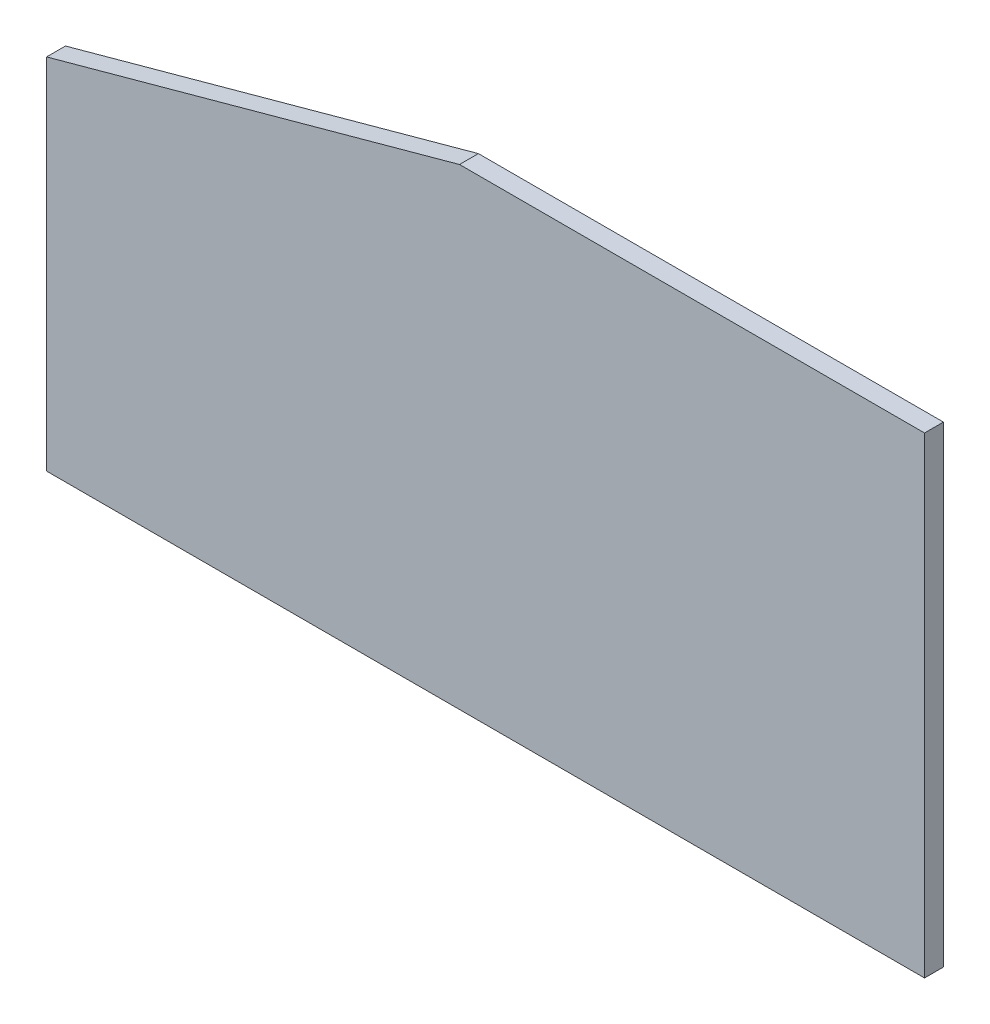
ISO-10303-21;
HEADER;
FILE_DESCRIPTION(('STEP AP214'),'2;1');
FILE_NAME('part.step','',(''),(''),'','','');
FILE_SCHEMA(('AUTOMOTIVE_DESIGN { 1 0 10303 214 1 1 1 1 }'));
ENDSEC;
DATA;
#1=APPLICATION_CONTEXT('core data for automotive mechanical design processes');
#2=APPLICATION_PROTOCOL_DEFINITION('international standard','automotive_design',2000,#1);
#3=PRODUCT_CONTEXT('',#1,'mechanical');
#4=PRODUCT('Part','Part','',(#3));
#5=PRODUCT_RELATED_PRODUCT_CATEGORY('part','',(#4));
#6=PRODUCT_DEFINITION_FORMATION('','',#4);
#7=PRODUCT_DEFINITION_CONTEXT('part definition',#1,'design');
#8=PRODUCT_DEFINITION('design','',#6,#7);
#9=PRODUCT_DEFINITION_SHAPE('','',#8);
#10=(LENGTH_UNIT() NAMED_UNIT(*) SI_UNIT(.MILLI.,.METRE.));
#11=(NAMED_UNIT(*) PLANE_ANGLE_UNIT() SI_UNIT($,.RADIAN.));
#12=(NAMED_UNIT(*) SI_UNIT($,.STERADIAN.) SOLID_ANGLE_UNIT());
#13=UNCERTAINTY_MEASURE_WITH_UNIT(LENGTH_MEASURE(1.E-05),#10,'distance_accuracy_value','');
#14=(GEOMETRIC_REPRESENTATION_CONTEXT(3) GLOBAL_UNCERTAINTY_ASSIGNED_CONTEXT((#13)) GLOBAL_UNIT_ASSIGNED_CONTEXT((#10,
#11,#12)) REPRESENTATION_CONTEXT('',''));
#15=CARTESIAN_POINT('',(0.,0.,0.));
#16=DIRECTION('',(0.,0.,1.));
#17=DIRECTION('',(1.,0.,0.));
#18=AXIS2_PLACEMENT_3D('',#15,#16,#17);
#19=CARTESIAN_POINT('',(-389.52380952381,-57.2916666666644,4.99999999999889));
#20=DIRECTION('',(1.,0.,0.));
#21=DIRECTION('',(0.,0.,-1.));
#22=AXIS2_PLACEMENT_3D('',#19,#20,#21);
#23=PLANE('',#22);
#24=DIRECTION('',(0.,-1.,0.));
#25=VECTOR('',#24,1.);
#26=CARTESIAN_POINT('',(-389.52380952381,-57.2916666666644,-1.38777878078145E-12));
#27=LINE('',#26,#25);
#28=CARTESIAN_POINT('',(-389.52380952381,37.7083333333333,-1.83186799063151E-12));
#29=VERTEX_POINT('',#28);
#30=CARTESIAN_POINT('',(-389.52380952381,-57.2916666666644,-1.38777878078145E-12));
#31=VERTEX_POINT('',#30);
#32=EDGE_CURVE('E109',#29,#31,#27,.T.);
#33=ORIENTED_EDGE('',*,*,#32,.T.);
#34=DIRECTION('',(0.,0.,-1.));
#35=VECTOR('',#34,1.);
#36=CARTESIAN_POINT('',(-389.52380952381,-57.2916666666644,4.99999999999889));
#37=LINE('',#36,#35);
#38=CARTESIAN_POINT('',(-389.52380952381,-57.2916666666644,4.99999999999889));
#39=VERTEX_POINT('',#38);
#40=EDGE_CURVE('E11',#39,#31,#37,.T.);
#41=ORIENTED_EDGE('',*,*,#40,.F.);
#42=DIRECTION('',(0.,-1.,0.));
#43=VECTOR('',#42,1.);
#44=CARTESIAN_POINT('',(-389.52380952381,-57.2916666666644,4.99999999999889));
#45=LINE('',#44,#43);
#46=CARTESIAN_POINT('',(-389.52380952381,37.7083333333378,4.99999999999823));
#47=VERTEX_POINT('',#46);
#48=EDGE_CURVE('E117',#47,#39,#45,.T.);
#49=ORIENTED_EDGE('',*,*,#48,.F.);
#50=DIRECTION('',(0.,0.,-1.));
#51=VECTOR('',#50,1.);
#52=CARTESIAN_POINT('',(-389.52380952381,37.7083333333378,4.99999999999823));
#53=LINE('',#52,#51);
#54=EDGE_CURVE('E105',#47,#29,#53,.T.);
#55=ORIENTED_EDGE('',*,*,#54,.T.);
#56=EDGE_LOOP('',(#33,#41,#49,#55));
#57=FACE_BOUND('',#56,.T.);
#58=ADVANCED_FACE('F35',(#57),#23,.F.);
#59=CARTESIAN_POINT('',(-389.52380952381,-57.2916666666644,4.99999999999889));
#60=DIRECTION('',(0.,1.,0.));
#61=DIRECTION('',(0.,0.,1.));
#62=AXIS2_PLACEMENT_3D('',#59,#60,#61);
#63=PLANE('',#62);
#64=DIRECTION('',(1.,0.,0.));
#65=VECTOR('',#64,1.);
#66=CARTESIAN_POINT('',(-389.52380952381,-57.2916666666644,-1.38777878078145E-12));
#67=LINE('',#66,#65);
#68=CARTESIAN_POINT('',(-157.023809523809,-57.2916666666644,0.));
#69=VERTEX_POINT('',#68);
#70=EDGE_CURVE('E112',#31,#69,#67,.T.);
#71=ORIENTED_EDGE('',*,*,#70,.T.);
#72=DIRECTION('',(0.,0.,-1.));
#73=VECTOR('',#72,1.);
#74=CARTESIAN_POINT('',(-157.023809523809,-57.2916666666644,4.99999999999973));
#75=LINE('',#74,#73);
#76=CARTESIAN_POINT('',(-157.023809523809,-57.2916666666644,4.99999999999973));
#77=VERTEX_POINT('',#76);
#78=EDGE_CURVE('E43',#77,#69,#75,.T.);
#79=ORIENTED_EDGE('',*,*,#78,.F.);
#80=DIRECTION('',(1.,0.,0.));
#81=VECTOR('',#80,1.);
#82=CARTESIAN_POINT('',(-389.52380952381,-57.2916666666644,4.99999999999889));
#83=LINE('',#82,#81);
#84=EDGE_CURVE('E85',#39,#77,#83,.T.);
#85=ORIENTED_EDGE('',*,*,#84,.F.);
#86=ORIENTED_EDGE('',*,*,#40,.T.);
#87=EDGE_LOOP('',(#71,#79,#85,#86));
#88=FACE_BOUND('',#87,.T.);
#89=ADVANCED_FACE('F136',(#88),#63,.F.);
#90=CARTESIAN_POINT('',(-157.023809523809,-57.2916666666644,4.99999999999973));
#91=DIRECTION('',(-1.,0.,0.));
#92=DIRECTION('',(0.,0.,1.));
#93=AXIS2_PLACEMENT_3D('',#90,#91,#92);
#94=PLANE('',#93);
#95=DIRECTION('',(0.,1.,0.));
#96=VECTOR('',#95,1.);
#97=CARTESIAN_POINT('',(-157.023809523809,-57.2916666666644,0.));
#98=LINE('',#97,#96);
#99=CARTESIAN_POINT('',(-157.023809523809,67.7083333333334,0.));
#100=VERTEX_POINT('',#99);
#101=EDGE_CURVE('E100',#69,#100,#98,.T.);
#102=ORIENTED_EDGE('',*,*,#101,.T.);
#103=DIRECTION('',(0.,0.,-1.));
#104=VECTOR('',#103,1.);
#105=CARTESIAN_POINT('',(-157.023809523809,67.7083333333378,5.00000000000017));
#106=LINE('',#105,#104);
#107=CARTESIAN_POINT('',(-157.023809523809,67.7083333333378,5.00000000000017));
#108=VERTEX_POINT('',#107);
#109=EDGE_CURVE('E97',#108,#100,#106,.T.);
#110=ORIENTED_EDGE('',*,*,#109,.F.);
#111=DIRECTION('',(0.,1.,0.));
#112=VECTOR('',#111,1.);
#113=CARTESIAN_POINT('',(-157.023809523809,-57.2916666666644,4.99999999999973));
#114=LINE('',#113,#112);
#115=EDGE_CURVE('E89',#77,#108,#114,.T.);
#116=ORIENTED_EDGE('',*,*,#115,.F.);
#117=ORIENTED_EDGE('',*,*,#78,.T.);
#118=EDGE_LOOP('',(#102,#110,#116,#117));
#119=FACE_BOUND('',#118,.T.);
#120=ADVANCED_FACE('F98',(#119),#94,.F.);
#121=CARTESIAN_POINT('',(-157.023809523809,67.7083333333378,5.00000000000017));
#122=DIRECTION('',(0.,-1.,0.));
#123=DIRECTION('',(0.,0.,-1.));
#124=AXIS2_PLACEMENT_3D('',#121,#122,#123);
#125=PLANE('',#124);
#126=DIRECTION('',(-1.,0.,0.));
#127=VECTOR('',#126,1.);
#128=CARTESIAN_POINT('',(-157.023809523809,67.7083333333334,0.));
#129=LINE('',#128,#127);
#130=CARTESIAN_POINT('',(-280.176608285444,67.7083333333334,-1.11022302462516E-13));
#131=VERTEX_POINT('',#130);
#132=EDGE_CURVE('E71',#100,#131,#129,.T.);
#133=ORIENTED_EDGE('',*,*,#132,.T.);
#134=DIRECTION('',(0.,0.,-1.));
#135=VECTOR('',#134,1.);
#136=CARTESIAN_POINT('',(-280.176608285444,67.7083333333378,5.));
#137=LINE('',#136,#135);
#138=CARTESIAN_POINT('',(-280.176608285444,67.7083333333378,5.));
#139=VERTEX_POINT('',#138);
#140=EDGE_CURVE('E101',#139,#131,#137,.T.);
#141=ORIENTED_EDGE('',*,*,#140,.F.);
#142=DIRECTION('',(-1.,0.,0.));
#143=VECTOR('',#142,1.);
#144=CARTESIAN_POINT('',(-157.023809523809,67.7083333333378,5.00000000000017));
#145=LINE('',#144,#143);
#146=EDGE_CURVE('E93',#108,#139,#145,.T.);
#147=ORIENTED_EDGE('',*,*,#146,.F.);
#148=ORIENTED_EDGE('',*,*,#109,.T.);
#149=EDGE_LOOP('',(#133,#141,#147,#148));
#150=FACE_BOUND('',#149,.T.);
#151=ADVANCED_FACE('F103',(#150),#125,.F.);
#152=CARTESIAN_POINT('',(-389.52380952381,37.7083333333378,4.99999999999823));
#153=DIRECTION('',(0.264578551643235,-0.964364137662931,0.));
#154=DIRECTION('',(0.964364137662934,0.264578551643234,0.));
#155=AXIS2_PLACEMENT_3D('',#152,#153,#154);
#156=PLANE('',#155);
#157=DIRECTION('',(-0.964364137662934,-0.264578551643234,0.));
#158=VECTOR('',#157,1.);
#159=CARTESIAN_POINT('',(-389.52380952381,37.7083333333333,-1.83186799063151E-12));
#160=LINE('',#159,#158);
#161=EDGE_CURVE('E77',#131,#29,#160,.T.);
#162=ORIENTED_EDGE('',*,*,#161,.T.);
#163=ORIENTED_EDGE('',*,*,#54,.F.);
#164=DIRECTION('',(-0.964364137662934,-0.264578551643234,0.));
#165=VECTOR('',#164,1.);
#166=CARTESIAN_POINT('',(-389.52380952381,37.7083333333378,4.99999999999823));
#167=LINE('',#166,#165);
#168=EDGE_CURVE('E51',#139,#47,#167,.T.);
#169=ORIENTED_EDGE('',*,*,#168,.F.);
#170=ORIENTED_EDGE('',*,*,#140,.T.);
#171=EDGE_LOOP('',(#162,#163,#169,#170));
#172=FACE_BOUND('',#171,.T.);
#173=ADVANCED_FACE('F125',(#172),#156,.F.);
#174=CARTESIAN_POINT('',(8.88178419700125E-13,4.44089209850063E-12,5.00000000000017));
#175=DIRECTION('',(0.,0.,1.));
#176=DIRECTION('',(1.,0.,0.));
#177=AXIS2_PLACEMENT_3D('',#174,#175,#176);
#178=PLANE('',#177);
#179=ORIENTED_EDGE('',*,*,#48,.T.);
#180=ORIENTED_EDGE('',*,*,#84,.T.);
#181=ORIENTED_EDGE('',*,*,#115,.T.);
#182=ORIENTED_EDGE('',*,*,#146,.T.);
#183=ORIENTED_EDGE('',*,*,#168,.T.);
#184=EDGE_LOOP('',(#179,#180,#181,#182,#183));
#185=FACE_BOUND('',#184,.T.);
#186=ADVANCED_FACE('F91',(#185),#178,.T.);
#187=CARTESIAN_POINT('',(0.,0.,0.));
#188=DIRECTION('',(0.,0.,1.));
#189=DIRECTION('',(1.,0.,0.));
#190=AXIS2_PLACEMENT_3D('',#187,#188,#189);
#191=PLANE('',#190);
#192=ORIENTED_EDGE('',*,*,#32,.F.);
#193=ORIENTED_EDGE('',*,*,#161,.F.);
#194=ORIENTED_EDGE('',*,*,#132,.F.);
#195=ORIENTED_EDGE('',*,*,#101,.F.);
#196=ORIENTED_EDGE('',*,*,#70,.F.);
#197=EDGE_LOOP('',(#192,#193,#194,#195,#196));
#198=FACE_BOUND('',#197,.T.);
#199=ADVANCED_FACE('F121',(#198),#191,.F.);
#200=CLOSED_SHELL('',(#58,#89,#120,#151,#173,#186,#199));
#201=MANIFOLD_SOLID_BREP('B2',#200);
#202=ADVANCED_BREP_SHAPE_REPRESENTATION('',(#18,#201),#14);
#203=SHAPE_DEFINITION_REPRESENTATION(#9,#202);
ENDSEC;
END-ISO-10303-21;
